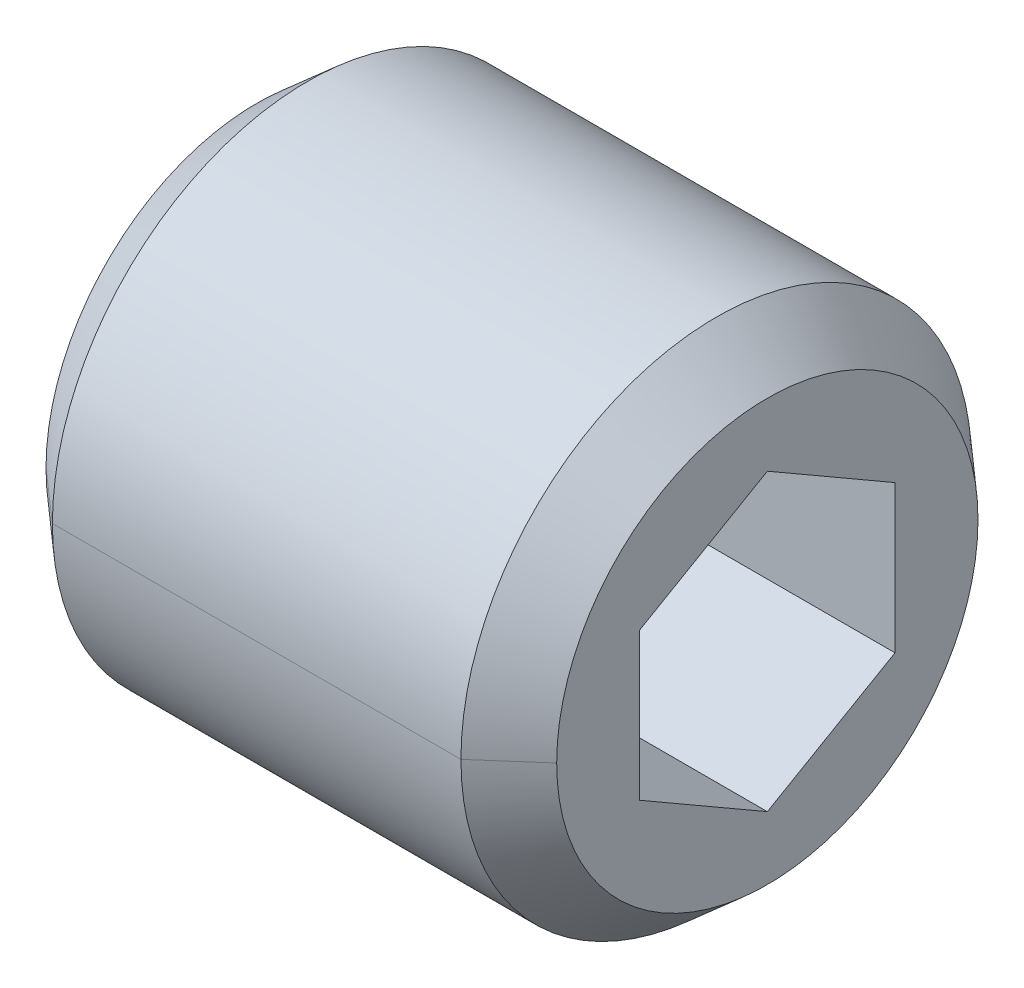
ISO-10303-21;
HEADER;
FILE_DESCRIPTION(('STEP AP214'),'2;1');
FILE_NAME('part.step','',(''),(''),'','','');
FILE_SCHEMA(('AUTOMOTIVE_DESIGN { 1 0 10303 214 1 1 1 1 }'));
ENDSEC;
DATA;
#1=APPLICATION_CONTEXT('core data for automotive mechanical design processes');
#2=APPLICATION_PROTOCOL_DEFINITION('international standard','automotive_design',2000,#1);
#3=PRODUCT_CONTEXT('',#1,'mechanical');
#4=PRODUCT('Part','Part','',(#3));
#5=PRODUCT_RELATED_PRODUCT_CATEGORY('part','',(#4));
#6=PRODUCT_DEFINITION_FORMATION('','',#4);
#7=PRODUCT_DEFINITION_CONTEXT('part definition',#1,'design');
#8=PRODUCT_DEFINITION('design','',#6,#7);
#9=PRODUCT_DEFINITION_SHAPE('','',#8);
#10=(LENGTH_UNIT() NAMED_UNIT(*) SI_UNIT(.MILLI.,.METRE.));
#11=(NAMED_UNIT(*) PLANE_ANGLE_UNIT() SI_UNIT($,.RADIAN.));
#12=(NAMED_UNIT(*) SI_UNIT($,.STERADIAN.) SOLID_ANGLE_UNIT());
#13=UNCERTAINTY_MEASURE_WITH_UNIT(LENGTH_MEASURE(1.E-05),#10,'distance_accuracy_value','');
#14=(GEOMETRIC_REPRESENTATION_CONTEXT(3) GLOBAL_UNCERTAINTY_ASSIGNED_CONTEXT((#13)) GLOBAL_UNIT_ASSIGNED_CONTEXT((#10,
#11,#12)) REPRESENTATION_CONTEXT('',''));
#15=CARTESIAN_POINT('',(0.,0.,0.));
#16=DIRECTION('',(0.,0.,1.));
#17=DIRECTION('',(1.,0.,0.));
#18=AXIS2_PLACEMENT_3D('',#15,#16,#17);
#19=CARTESIAN_POINT('',(-140.854423278,-344.919569251,0.));
#20=DIRECTION('',(0.,-0.866025403480584,-0.500000000526291));
#21=DIRECTION('',(0.,0.500000000526291,-0.866025403480584));
#22=AXIS2_PLACEMENT_3D('',#19,#20,#21);
#23=PLANE('',#22);
#24=DIRECTION('',(1.,0.,0.));
#25=VECTOR('',#24,1.);
#26=CARTESIAN_POINT('',(-140.854423278,-344.919569251,0.));
#27=LINE('',#26,#25);
#28=CARTESIAN_POINT('',(-140.854423278,-344.919569251,0.));
#29=VERTEX_POINT('',#28);
#30=CARTESIAN_POINT('',(-138.354423278,-344.919569251,0.));
#31=VERTEX_POINT('',#30);
#32=EDGE_CURVE('E156',#29,#31,#27,.T.);
#33=ORIENTED_EDGE('',*,*,#32,.T.);
#34=DIRECTION('',(0.,0.500000000526291,-0.866025403480584));
#35=VECTOR('',#34,1.);
#36=CARTESIAN_POINT('',(-138.354423278,-344.919569251,0.));
#37=LINE('',#36,#35);
#38=CARTESIAN_POINT('',(-138.354423278,-344.34221898115,-0.999999999816163));
#39=VERTEX_POINT('',#38);
#40=EDGE_CURVE('E161',#39,#31,#37,.F.);
#41=ORIENTED_EDGE('',*,*,#40,.F.);
#42=DIRECTION('',(-1.,0.,0.));
#43=VECTOR('',#42,1.);
#44=CARTESIAN_POINT('',(-140.854423278,-344.3422189812,-1.));
#45=LINE('',#44,#43);
#46=CARTESIAN_POINT('',(-140.854423278,-344.34221898105,-1.00000000000002));
#47=VERTEX_POINT('',#46);
#48=EDGE_CURVE('E146',#39,#47,#45,.T.);
#49=ORIENTED_EDGE('',*,*,#48,.T.);
#50=DIRECTION('',(0.,0.500000000526291,-0.866025403480584));
#51=VECTOR('',#50,1.);
#52=CARTESIAN_POINT('',(-140.854423278,-344.919569251,0.));
#53=LINE('',#52,#51);
#54=EDGE_CURVE('E159',#29,#47,#53,.T.);
#55=ORIENTED_EDGE('',*,*,#54,.F.);
#56=EDGE_LOOP('',(#33,#41,#49,#55));
#57=FACE_BOUND('',#56,.T.);
#58=ADVANCED_FACE('F17',(#57),#23,.F.);
#59=CARTESIAN_POINT('',(-140.854423278,-344.342218981,1.));
#60=DIRECTION('',(0.,-0.866025403480584,0.500000000526291));
#61=DIRECTION('',(0.,-0.500000000526291,-0.866025403480584));
#62=AXIS2_PLACEMENT_3D('',#59,#60,#61);
#63=PLANE('',#62);
#64=DIRECTION('',(1.,0.,0.));
#65=VECTOR('',#64,1.);
#66=CARTESIAN_POINT('',(-140.854423278,-344.342218981,1.));
#67=LINE('',#66,#65);
#68=CARTESIAN_POINT('',(-140.854423278,-344.342218981104,0.999999999818809));
#69=VERTEX_POINT('',#68);
#70=CARTESIAN_POINT('',(-138.354423278,-344.342218981154,0.999999999726885));
#71=VERTEX_POINT('',#70);
#72=EDGE_CURVE('E141',#69,#71,#67,.T.);
#73=ORIENTED_EDGE('',*,*,#72,.T.);
#74=DIRECTION('',(0.,-0.500000000526291,-0.866025403480584));
#75=VECTOR('',#74,1.);
#76=CARTESIAN_POINT('',(-138.354423278,-344.342218981,1.));
#77=LINE('',#76,#75);
#78=EDGE_CURVE('E154',#31,#71,#77,.F.);
#79=ORIENTED_EDGE('',*,*,#78,.F.);
#80=ORIENTED_EDGE('',*,*,#32,.F.);
#81=DIRECTION('',(0.,-0.500000000526291,-0.866025403480584));
#82=VECTOR('',#81,1.);
#83=CARTESIAN_POINT('',(-140.854423278,-344.342218981,1.));
#84=LINE('',#83,#82);
#85=EDGE_CURVE('E151',#69,#29,#84,.T.);
#86=ORIENTED_EDGE('',*,*,#85,.F.);
#87=EDGE_LOOP('',(#73,#79,#80,#86));
#88=FACE_BOUND('',#87,.T.);
#89=ADVANCED_FACE('F225',(#88),#63,.F.);
#90=CARTESIAN_POINT('',(-140.854423278,-344.342218981,-1.));
#91=DIRECTION('',(0.,0.,-1.));
#92=DIRECTION('',(-1.,0.,0.));
#93=AXIS2_PLACEMENT_3D('',#90,#91,#92);
#94=PLANE('',#93);
#95=ORIENTED_EDGE('',*,*,#48,.F.);
#96=DIRECTION('',(0.,1.,0.));
#97=VECTOR('',#96,1.);
#98=CARTESIAN_POINT('',(-138.354423278,-344.342218981,-1.));
#99=LINE('',#98,#97);
#100=CARTESIAN_POINT('',(-138.354423278,-343.187518442848,-0.999999999725559));
#101=VERTEX_POINT('',#100);
#102=EDGE_CURVE('E149',#101,#39,#99,.F.);
#103=ORIENTED_EDGE('',*,*,#102,.F.);
#104=DIRECTION('',(1.,0.,0.));
#105=VECTOR('',#104,1.);
#106=CARTESIAN_POINT('',(-140.854423278,-343.187518442791,-0.999999999637637));
#107=LINE('',#106,#105);
#108=CARTESIAN_POINT('',(-140.854423278,-343.187518442948,-0.999999999909409));
#109=VERTEX_POINT('',#108);
#110=EDGE_CURVE('E134',#101,#109,#107,.F.);
#111=ORIENTED_EDGE('',*,*,#110,.T.);
#112=DIRECTION('',(0.,1.,0.));
#113=VECTOR('',#112,1.);
#114=CARTESIAN_POINT('',(-140.854423278,-344.342218981,-1.));
#115=LINE('',#114,#113);
#116=EDGE_CURVE('E144',#47,#109,#115,.T.);
#117=ORIENTED_EDGE('',*,*,#116,.F.);
#118=EDGE_LOOP('',(#95,#103,#111,#117));
#119=FACE_BOUND('',#118,.T.);
#120=ADVANCED_FACE('F222',(#119),#94,.F.);
#121=CARTESIAN_POINT('',(-140.854423278,-343.187518443,1.));
#122=DIRECTION('',(0.,0.,1.));
#123=DIRECTION('',(1.,0.,0.));
#124=AXIS2_PLACEMENT_3D('',#121,#122,#123);
#125=PLANE('',#124);
#126=DIRECTION('',(1.,0.,0.));
#127=VECTOR('',#126,1.);
#128=CARTESIAN_POINT('',(-140.854423278,-343.187518443,1.));
#129=LINE('',#128,#127);
#130=CARTESIAN_POINT('',(-140.854423278,-343.1875184429,1.));
#131=VERTEX_POINT('',#130);
#132=CARTESIAN_POINT('',(-138.354423278,-343.18751844285,0.999999999908076));
#133=VERTEX_POINT('',#132);
#134=EDGE_CURVE('E126',#131,#133,#129,.T.);
#135=ORIENTED_EDGE('',*,*,#134,.T.);
#136=DIRECTION('',(0.,1.,0.));
#137=VECTOR('',#136,1.);
#138=CARTESIAN_POINT('',(-138.354423278,-343.187518443,1.));
#139=LINE('',#138,#137);
#140=EDGE_CURVE('E139',#71,#133,#139,.T.);
#141=ORIENTED_EDGE('',*,*,#140,.F.);
#142=ORIENTED_EDGE('',*,*,#72,.F.);
#143=DIRECTION('',(0.,1.,0.));
#144=VECTOR('',#143,1.);
#145=CARTESIAN_POINT('',(-140.854423278,-344.919569251,1.));
#146=LINE('',#145,#144);
#147=EDGE_CURVE('E132',#69,#131,#146,.T.);
#148=ORIENTED_EDGE('',*,*,#147,.T.);
#149=EDGE_LOOP('',(#135,#141,#142,#148));
#150=FACE_BOUND('',#149,.T.);
#151=ADVANCED_FACE('F218',(#150),#125,.F.);
#152=CARTESIAN_POINT('',(-140.854423278,-343.187518443,-1.));
#153=DIRECTION('',(0.,0.866025403855576,-0.499999999876786));
#154=DIRECTION('',(0.,0.499999999876786,0.866025403855576));
#155=AXIS2_PLACEMENT_3D('',#152,#153,#154);
#156=PLANE('',#155);
#157=ORIENTED_EDGE('',*,*,#110,.F.);
#158=DIRECTION('',(0.,0.499999999876786,0.866025403855576));
#159=VECTOR('',#158,1.);
#160=CARTESIAN_POINT('',(-138.354423278,-343.187518443,-1.));
#161=LINE('',#160,#159);
#162=CARTESIAN_POINT('',(-138.354423278,-342.610168174,0.));
#163=VERTEX_POINT('',#162);
#164=EDGE_CURVE('E137',#163,#101,#161,.F.);
#165=ORIENTED_EDGE('',*,*,#164,.F.);
#166=DIRECTION('',(1.,0.,0.));
#167=VECTOR('',#166,1.);
#168=CARTESIAN_POINT('',(-140.854423278,-342.610168174,0.));
#169=LINE('',#168,#167);
#170=CARTESIAN_POINT('',(-140.854423278,-342.610168174,0.));
#171=VERTEX_POINT('',#170);
#172=EDGE_CURVE('E124',#163,#171,#169,.F.);
#173=ORIENTED_EDGE('',*,*,#172,.T.);
#174=DIRECTION('',(0.,-0.4999999998768,-0.866025403855568));
#175=VECTOR('',#174,1.);
#176=CARTESIAN_POINT('',(-140.854423278,-342.610168174,0.));
#177=LINE('',#176,#175);
#178=EDGE_CURVE('E129',#171,#109,#177,.T.);
#179=ORIENTED_EDGE('',*,*,#178,.T.);
#180=EDGE_LOOP('',(#157,#165,#173,#179));
#181=FACE_BOUND('',#180,.T.);
#182=ADVANCED_FACE('F214',(#181),#156,.F.);
#183=CARTESIAN_POINT('',(-140.854423278,-344.919569251,-1.));
#184=DIRECTION('',(-1.,0.,0.));
#185=DIRECTION('',(0.,0.,1.));
#186=AXIS2_PLACEMENT_3D('',#183,#184,#185);
#187=PLANE('',#186);
#188=ORIENTED_EDGE('',*,*,#178,.F.);
#189=DIRECTION('',(0.,-0.499999999876786,0.866025403855576));
#190=VECTOR('',#189,1.);
#191=CARTESIAN_POINT('',(-140.854423278,-342.610168174,0.));
#192=LINE('',#191,#190);
#193=EDGE_CURVE('E115',#171,#131,#192,.T.);
#194=ORIENTED_EDGE('',*,*,#193,.T.);
#195=ORIENTED_EDGE('',*,*,#147,.F.);
#196=ORIENTED_EDGE('',*,*,#85,.T.);
#197=ORIENTED_EDGE('',*,*,#54,.T.);
#198=ORIENTED_EDGE('',*,*,#116,.T.);
#199=EDGE_LOOP('',(#188,#194,#195,#196,#197,#198));
#200=FACE_BOUND('',#199,.T.);
#201=ADVANCED_FACE('F210',(#200),#187,.F.);
#202=CARTESIAN_POINT('',(-140.854423278,-342.610168174,0.));
#203=DIRECTION('',(0.,0.866025403855576,0.499999999876786));
#204=DIRECTION('',(0.,-0.499999999876786,0.866025403855576));
#205=AXIS2_PLACEMENT_3D('',#202,#203,#204);
#206=PLANE('',#205);
#207=ORIENTED_EDGE('',*,*,#172,.F.);
#208=DIRECTION('',(0.,-0.499999999884853,0.866025403850919));
#209=VECTOR('',#208,1.);
#210=CARTESIAN_POINT('',(-138.354423278,-342.610168174,0.));
#211=LINE('',#210,#209);
#212=EDGE_CURVE('E102',#163,#133,#211,.T.);
#213=ORIENTED_EDGE('',*,*,#212,.T.);
#214=ORIENTED_EDGE('',*,*,#134,.F.);
#215=ORIENTED_EDGE('',*,*,#193,.F.);
#216=EDGE_LOOP('',(#207,#213,#214,#215));
#217=FACE_BOUND('',#216,.T.);
#218=ADVANCED_FACE('F206',(#217),#206,.F.);
#219=CARTESIAN_POINT('',(-138.354423278,-345.434668712,-1.6698));
#220=DIRECTION('',(-1.,0.,0.));
#221=DIRECTION('',(0.,0.,1.));
#222=AXIS2_PLACEMENT_3D('',#219,#220,#221);
#223=PLANE('',#222);
#224=ORIENTED_EDGE('',*,*,#164,.T.);
#225=ORIENTED_EDGE('',*,*,#102,.T.);
#226=ORIENTED_EDGE('',*,*,#40,.T.);
#227=ORIENTED_EDGE('',*,*,#78,.T.);
#228=ORIENTED_EDGE('',*,*,#140,.T.);
#229=ORIENTED_EDGE('',*,*,#212,.F.);
#230=EDGE_LOOP('',(#224,#225,#226,#227,#228,#229));
#231=FACE_BOUND('',#230,.T.);
#232=CARTESIAN_POINT('',(-138.354423277974,-343.764868712,0.));
#233=DIRECTION('',(-1.,0.,0.));
#234=DIRECTION('',(0.,0.,1.));
#235=AXIS2_PLACEMENT_3D('',#232,#233,#234);
#236=CIRCLE('',#235,1.65000000004057);
#237=CARTESIAN_POINT('',(-138.354423277974,-343.764868712,-1.65000000004057));
#238=VERTEX_POINT('',#237);
#239=CARTESIAN_POINT('',(-138.354423277974,-343.764868712,1.65000000004057));
#240=VERTEX_POINT('',#239);
#241=EDGE_CURVE('E121',#238,#240,#236,.T.);
#242=ORIENTED_EDGE('',*,*,#241,.F.);
#243=CARTESIAN_POINT('',(-138.354423277974,-343.764868712,0.));
#244=DIRECTION('',(-1.,0.,0.));
#245=DIRECTION('',(0.,0.,1.));
#246=AXIS2_PLACEMENT_3D('',#243,#244,#245);
#247=CIRCLE('',#246,1.65000000004057);
#248=EDGE_CURVE('E101',#240,#238,#247,.T.);
#249=ORIENTED_EDGE('',*,*,#248,.F.);
#250=EDGE_LOOP('',(#242,#249));
#251=FACE_BOUND('',#250,.T.);
#252=ADVANCED_FACE('F203',(#231,#251),#223,.F.);
#253=CARTESIAN_POINT('',(-142.354423278,-345.434668712,1.6698));
#254=DIRECTION('',(1.,0.,0.));
#255=DIRECTION('',(0.,0.,-1.));
#256=AXIS2_PLACEMENT_3D('',#253,#254,#255);
#257=PLANE('',#256);
#258=CARTESIAN_POINT('',(-142.354423277993,-343.764868712,0.));
#259=DIRECTION('',(1.,0.,0.));
#260=DIRECTION('',(0.,0.,-1.));
#261=AXIS2_PLACEMENT_3D('',#258,#259,#260);
#262=CIRCLE('',#261,1.64999999999083);
#263=CARTESIAN_POINT('',(-142.354423277993,-343.764868712,1.64999999999083));
#264=VERTEX_POINT('',#263);
#265=CARTESIAN_POINT('',(-142.354423277993,-343.764868712,-1.64999999998727));
#266=VERTEX_POINT('',#265);
#267=EDGE_CURVE('E92',#264,#266,#262,.T.);
#268=ORIENTED_EDGE('',*,*,#267,.F.);
#269=CARTESIAN_POINT('',(-142.354423277993,-343.764868712,0.));
#270=DIRECTION('',(1.,0.,0.));
#271=DIRECTION('',(0.,0.,-1.));
#272=AXIS2_PLACEMENT_3D('',#269,#270,#271);
#273=CIRCLE('',#272,1.64999999999083);
#274=EDGE_CURVE('E20',#266,#264,#273,.T.);
#275=ORIENTED_EDGE('',*,*,#274,.F.);
#276=EDGE_LOOP('',(#268,#275));
#277=FACE_BOUND('',#276,.T.);
#278=ADVANCED_FACE('F93',(#277),#257,.F.);
#279=CARTESIAN_POINT('',(-141.954423278037,-343.764868712,0.));
#280=DIRECTION('',(1.,0.,0.));
#281=DIRECTION('',(0.,0.,-1.));
#282=AXIS2_PLACEMENT_3D('',#279,#280,#281);
#283=CONICAL_SURFACE('',#282,1.9999999999527,0.718829999621624);
#284=DIRECTION('',(-0.752576694706963,0.,0.658504607868421));
#285=VECTOR('',#284,1.);
#286=CARTESIAN_POINT('',(499000.,-343.764868712,-436751.210120255));
#287=LINE('',#286,#285);
#288=CARTESIAN_POINT('',(-141.954423278028,-343.764868712,-1.99999999996453));
#289=VERTEX_POINT('',#288);
#290=EDGE_CURVE('E96',#266,#289,#287,.F.);
#291=ORIENTED_EDGE('',*,*,#290,.F.);
#292=ORIENTED_EDGE('',*,*,#274,.T.);
#293=DIRECTION('',(-0.752576694706963,0.,-0.658504607868421));
#294=VECTOR('',#293,1.);
#295=CARTESIAN_POINT('',(499000.,-343.764868711947,436751.210120255));
#296=LINE('',#295,#294);
#297=CARTESIAN_POINT('',(-141.954423278023,-343.764868712,1.99999999997044));
#298=VERTEX_POINT('',#297);
#299=EDGE_CURVE('E100',#298,#264,#296,.T.);
#300=ORIENTED_EDGE('',*,*,#299,.F.);
#301=CARTESIAN_POINT('',(-141.954423278,-343.764868712,0.));
#302=DIRECTION('',(-1.,0.,0.));
#303=DIRECTION('',(0.,0.,1.));
#304=AXIS2_PLACEMENT_3D('',#301,#302,#303);
#305=CIRCLE('',#304,2.);
#306=EDGE_CURVE('E35',#289,#298,#305,.F.);
#307=ORIENTED_EDGE('',*,*,#306,.F.);
#308=EDGE_LOOP('',(#291,#292,#300,#307));
#309=FACE_BOUND('',#308,.T.);
#310=ADVANCED_FACE('F99',(#309),#283,.T.);
#311=CARTESIAN_POINT('',(-138.754423278044,-343.764868712,0.));
#312=DIRECTION('',(-1.,0.,0.));
#313=DIRECTION('',(0.,0.,1.));
#314=AXIS2_PLACEMENT_3D('',#311,#312,#313);
#315=CONICAL_SURFACE('',#314,2.00000000006639,0.718829999571321);
#316=DIRECTION('',(0.752576694706963,0.,-0.658504607868421));
#317=VECTOR('',#316,1.);
#318=CARTESIAN_POINT('',(-499000.,-343.764868712,436505.589879518));
#319=LINE('',#318,#317);
#320=CARTESIAN_POINT('',(-138.754423278033,-343.764868712,2.00000000004979));
#321=VERTEX_POINT('',#320);
#322=EDGE_CURVE('E118',#240,#321,#319,.F.);
#323=ORIENTED_EDGE('',*,*,#322,.F.);
#324=ORIENTED_EDGE('',*,*,#248,.T.);
#325=DIRECTION('',(0.752576694706963,0.,0.658504607868421));
#326=VECTOR('',#325,1.);
#327=CARTESIAN_POINT('',(-499000.,-343.764868711947,-436505.589879518));
#328=LINE('',#327,#326);
#329=CARTESIAN_POINT('',(-138.754423278033,-343.764868712,-2.00000000004979));
#330=VERTEX_POINT('',#329);
#331=EDGE_CURVE('E97',#330,#238,#328,.T.);
#332=ORIENTED_EDGE('',*,*,#331,.F.);
#333=CARTESIAN_POINT('',(-138.754423278,-343.764868712,0.));
#334=DIRECTION('',(-1.,0.,0.));
#335=DIRECTION('',(0.,0.,1.));
#336=AXIS2_PLACEMENT_3D('',#333,#334,#335);
#337=CIRCLE('',#336,2.);
#338=EDGE_CURVE('E108',#321,#330,#337,.T.);
#339=ORIENTED_EDGE('',*,*,#338,.F.);
#340=EDGE_LOOP('',(#323,#324,#332,#339));
#341=FACE_BOUND('',#340,.T.);
#342=ADVANCED_FACE('F167',(#341),#315,.T.);
#343=CARTESIAN_POINT('',(-138.754423278044,-343.764868712,0.));
#344=DIRECTION('',(-1.,0.,0.));
#345=DIRECTION('',(0.,0.,1.));
#346=AXIS2_PLACEMENT_3D('',#343,#344,#345);
#347=CONICAL_SURFACE('',#346,2.00000000006639,0.718829999571321);
#348=CARTESIAN_POINT('',(-138.754423278,-343.764868712,0.));
#349=DIRECTION('',(-1.,0.,0.));
#350=DIRECTION('',(0.,0.,1.));
#351=AXIS2_PLACEMENT_3D('',#348,#349,#350);
#352=CIRCLE('',#351,2.);
#353=EDGE_CURVE('E173',#330,#321,#352,.T.);
#354=ORIENTED_EDGE('',*,*,#353,.F.);
#355=ORIENTED_EDGE('',*,*,#331,.T.);
#356=ORIENTED_EDGE('',*,*,#241,.T.);
#357=ORIENTED_EDGE('',*,*,#322,.T.);
#358=EDGE_LOOP('',(#354,#355,#356,#357));
#359=FACE_BOUND('',#358,.T.);
#360=ADVANCED_FACE('F171',(#359),#347,.T.);
#361=CARTESIAN_POINT('',(-141.954423278037,-343.764868712,0.));
#362=DIRECTION('',(1.,0.,0.));
#363=DIRECTION('',(0.,0.,-1.));
#364=AXIS2_PLACEMENT_3D('',#361,#362,#363);
#365=CONICAL_SURFACE('',#364,1.9999999999527,0.718829999621624);
#366=CARTESIAN_POINT('',(-141.954423278,-343.764868712,0.));
#367=DIRECTION('',(-1.,0.,0.));
#368=DIRECTION('',(0.,0.,1.));
#369=AXIS2_PLACEMENT_3D('',#366,#367,#368);
#370=CIRCLE('',#369,2.);
#371=EDGE_CURVE('E26',#298,#289,#370,.F.);
#372=ORIENTED_EDGE('',*,*,#371,.F.);
#373=ORIENTED_EDGE('',*,*,#299,.T.);
#374=ORIENTED_EDGE('',*,*,#267,.T.);
#375=ORIENTED_EDGE('',*,*,#290,.T.);
#376=EDGE_LOOP('',(#372,#373,#374,#375));
#377=FACE_BOUND('',#376,.T.);
#378=ADVANCED_FACE('F104',(#377),#365,.T.);
#379=CARTESIAN_POINT('',(-138.754423278,-343.764868712,0.));
#380=DIRECTION('',(-1.,0.,0.));
#381=DIRECTION('',(0.,0.,1.));
#382=AXIS2_PLACEMENT_3D('',#379,#380,#381);
#383=CYLINDRICAL_SURFACE('',#382,2.);
#384=DIRECTION('',(-1.,0.,0.));
#385=VECTOR('',#384,1.);
#386=CARTESIAN_POINT('',(-138.754423278,-343.764868712,2.));
#387=LINE('',#386,#385);
#388=EDGE_CURVE('E177',#321,#298,#387,.T.);
#389=ORIENTED_EDGE('',*,*,#388,.F.);
#390=ORIENTED_EDGE('',*,*,#338,.T.);
#391=DIRECTION('',(-1.,0.,0.));
#392=VECTOR('',#391,1.);
#393=CARTESIAN_POINT('',(-138.754423278,-343.764868712,-2.));
#394=LINE('',#393,#392);
#395=EDGE_CURVE('E11',#289,#330,#394,.F.);
#396=ORIENTED_EDGE('',*,*,#395,.F.);
#397=ORIENTED_EDGE('',*,*,#306,.T.);
#398=EDGE_LOOP('',(#389,#390,#396,#397));
#399=FACE_BOUND('',#398,.T.);
#400=ADVANCED_FACE('F181',(#399),#383,.T.);
#401=CARTESIAN_POINT('',(-138.754423278,-343.764868712,0.));
#402=DIRECTION('',(-1.,0.,0.));
#403=DIRECTION('',(0.,0.,1.));
#404=AXIS2_PLACEMENT_3D('',#401,#402,#403);
#405=CYLINDRICAL_SURFACE('',#404,2.);
#406=ORIENTED_EDGE('',*,*,#371,.T.);
#407=ORIENTED_EDGE('',*,*,#395,.T.);
#408=ORIENTED_EDGE('',*,*,#353,.T.);
#409=ORIENTED_EDGE('',*,*,#388,.T.);
#410=EDGE_LOOP('',(#406,#407,#408,#409));
#411=FACE_BOUND('',#410,.T.);
#412=ADVANCED_FACE('F182',(#411),#405,.T.);
#413=CLOSED_SHELL('',(#58,#89,#120,#151,#182,#201,#218,#252,#278,#310,#342,#360,#378,#400,#412));
#414=MANIFOLD_SOLID_BREP('B1',#413);
#415=ADVANCED_BREP_SHAPE_REPRESENTATION('',(#18,#414),#14);
#416=SHAPE_DEFINITION_REPRESENTATION(#9,#415);
ENDSEC;
END-ISO-10303-21;
